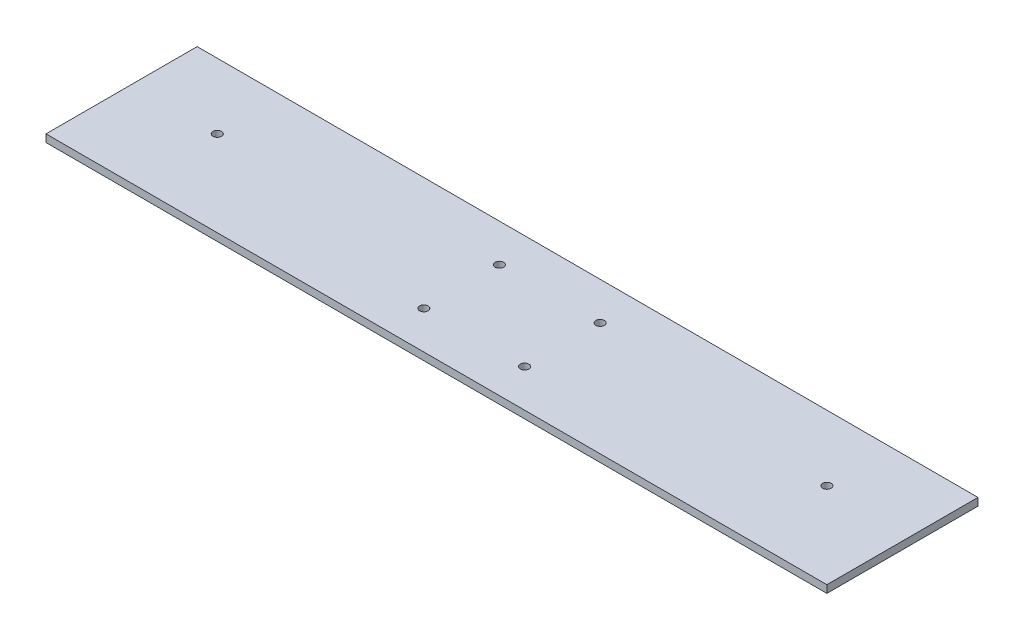
ISO-10303-21;
HEADER;
FILE_DESCRIPTION(('STEP AP214'),'2;1');
FILE_NAME('part.step','',(''),(''),'','','');
FILE_SCHEMA(('AUTOMOTIVE_DESIGN { 1 0 10303 214 1 1 1 1 }'));
ENDSEC;
DATA;
#1=APPLICATION_CONTEXT('core data for automotive mechanical design processes');
#2=APPLICATION_PROTOCOL_DEFINITION('international standard','automotive_design',2000,#1);
#3=PRODUCT_CONTEXT('',#1,'mechanical');
#4=PRODUCT('Part','Part','',(#3));
#5=PRODUCT_RELATED_PRODUCT_CATEGORY('part','',(#4));
#6=PRODUCT_DEFINITION_FORMATION('','',#4);
#7=PRODUCT_DEFINITION_CONTEXT('part definition',#1,'design');
#8=PRODUCT_DEFINITION('design','',#6,#7);
#9=PRODUCT_DEFINITION_SHAPE('','',#8);
#10=(LENGTH_UNIT() NAMED_UNIT(*) SI_UNIT(.MILLI.,.METRE.));
#11=(NAMED_UNIT(*) PLANE_ANGLE_UNIT() SI_UNIT($,.RADIAN.));
#12=(NAMED_UNIT(*) SI_UNIT($,.STERADIAN.) SOLID_ANGLE_UNIT());
#13=UNCERTAINTY_MEASURE_WITH_UNIT(LENGTH_MEASURE(1.E-05),#10,'distance_accuracy_value','');
#14=(GEOMETRIC_REPRESENTATION_CONTEXT(3) GLOBAL_UNCERTAINTY_ASSIGNED_CONTEXT((#13)) GLOBAL_UNIT_ASSIGNED_CONTEXT((#10,
#11,#12)) REPRESENTATION_CONTEXT('',''));
#15=CARTESIAN_POINT('',(0.,0.,0.));
#16=DIRECTION('',(0.,0.,1.));
#17=DIRECTION('',(1.,0.,0.));
#18=AXIS2_PLACEMENT_3D('',#15,#16,#17);
#19=CARTESIAN_POINT('',(0.,0.,0.));
#20=DIRECTION('',(0.,-1.,0.));
#21=DIRECTION('',(0.,0.,-1.));
#22=AXIS2_PLACEMENT_3D('',#19,#20,#21);
#23=PLANE('',#22);
#24=CARTESIAN_POINT('',(266.,0.,-34.));
#25=DIRECTION('',(0.,1.,0.));
#26=DIRECTION('',(0.,0.,1.));
#27=AXIS2_PLACEMENT_3D('',#24,#25,#26);
#28=CIRCLE('',#27,1.69999999999998);
#29=CARTESIAN_POINT('',(266.,0.,-32.3));
#30=VERTEX_POINT('',#29);
#31=EDGE_CURVE('E168',#30,#30,#28,.T.);
#32=ORIENTED_EDGE('',*,*,#31,.T.);
#33=EDGE_LOOP('',(#32));
#34=FACE_BOUND('',#33,.T.);
#35=DIRECTION('',(0.,0.,1.));
#36=VECTOR('',#35,1.);
#37=CARTESIAN_POINT('',(-10.,0.,0.));
#38=LINE('',#37,#36);
#39=CARTESIAN_POINT('',(-10.,0.,-60.));
#40=VERTEX_POINT('',#39);
#41=CARTESIAN_POINT('',(-10.,0.,0.));
#42=VERTEX_POINT('',#41);
#43=EDGE_CURVE('E108',#40,#42,#38,.T.);
#44=ORIENTED_EDGE('',*,*,#43,.F.);
#45=DIRECTION('',(-1.,0.,0.));
#46=VECTOR('',#45,1.);
#47=CARTESIAN_POINT('',(-10.,0.,-60.));
#48=LINE('',#47,#46);
#49=CARTESIAN_POINT('',(300.,0.,-60.));
#50=VERTEX_POINT('',#49);
#51=EDGE_CURVE('E80',#50,#40,#48,.T.);
#52=ORIENTED_EDGE('',*,*,#51,.F.);
#53=DIRECTION('',(0.,0.,-1.));
#54=VECTOR('',#53,1.);
#55=CARTESIAN_POINT('',(300.,0.,0.));
#56=LINE('',#55,#54);
#57=CARTESIAN_POINT('',(300.,0.,0.));
#58=VERTEX_POINT('',#57);
#59=EDGE_CURVE('E74',#58,#50,#56,.T.);
#60=ORIENTED_EDGE('',*,*,#59,.F.);
#61=DIRECTION('',(1.,0.,0.));
#62=VECTOR('',#61,1.);
#63=CARTESIAN_POINT('',(-10.,0.,0.));
#64=LINE('',#63,#62);
#65=EDGE_CURVE('E97',#42,#58,#64,.T.);
#66=ORIENTED_EDGE('',*,*,#65,.F.);
#67=EDGE_LOOP('',(#44,#52,#60,#66));
#68=FACE_BOUND('',#67,.T.);
#69=CARTESIAN_POINT('',(125.,0.,-45.));
#70=DIRECTION('',(0.,1.,0.));
#71=DIRECTION('',(0.,0.,1.));
#72=AXIS2_PLACEMENT_3D('',#69,#70,#71);
#73=CIRCLE('',#72,1.70000000000001);
#74=CARTESIAN_POINT('',(125.,0.,-43.3));
#75=VERTEX_POINT('',#74);
#76=EDGE_CURVE('E112',#75,#75,#73,.T.);
#77=ORIENTED_EDGE('',*,*,#76,.T.);
#78=EDGE_LOOP('',(#77));
#79=FACE_BOUND('',#78,.T.);
#80=CARTESIAN_POINT('',(165.,0.,-45.));
#81=DIRECTION('',(0.,1.,0.));
#82=DIRECTION('',(0.,0.,1.));
#83=AXIS2_PLACEMENT_3D('',#80,#81,#82);
#84=CIRCLE('',#83,1.70000000000001);
#85=CARTESIAN_POINT('',(165.,0.,-43.3));
#86=VERTEX_POINT('',#85);
#87=EDGE_CURVE('E136',#86,#86,#84,.T.);
#88=ORIENTED_EDGE('',*,*,#87,.T.);
#89=EDGE_LOOP('',(#88));
#90=FACE_BOUND('',#89,.T.);
#91=CARTESIAN_POINT('',(165.,0.,-15.));
#92=DIRECTION('',(0.,1.,0.));
#93=DIRECTION('',(0.,0.,1.));
#94=AXIS2_PLACEMENT_3D('',#91,#92,#93);
#95=CIRCLE('',#94,1.70000000000001);
#96=CARTESIAN_POINT('',(165.,0.,-13.3));
#97=VERTEX_POINT('',#96);
#98=EDGE_CURVE('E144',#97,#97,#95,.T.);
#99=ORIENTED_EDGE('',*,*,#98,.T.);
#100=EDGE_LOOP('',(#99));
#101=FACE_BOUND('',#100,.T.);
#102=CARTESIAN_POINT('',(125.,0.,-15.));
#103=DIRECTION('',(0.,1.,0.));
#104=DIRECTION('',(0.,0.,1.));
#105=AXIS2_PLACEMENT_3D('',#102,#103,#104);
#106=CIRCLE('',#105,1.70000000000001);
#107=CARTESIAN_POINT('',(125.,0.,-13.3));
#108=VERTEX_POINT('',#107);
#109=EDGE_CURVE('E152',#108,#108,#106,.T.);
#110=ORIENTED_EDGE('',*,*,#109,.T.);
#111=EDGE_LOOP('',(#110));
#112=FACE_BOUND('',#111,.T.);
#113=CARTESIAN_POINT('',(24.,0.,-34.));
#114=DIRECTION('',(0.,1.,0.));
#115=DIRECTION('',(0.,0.,1.));
#116=AXIS2_PLACEMENT_3D('',#113,#114,#115);
#117=CIRCLE('',#116,1.7);
#118=CARTESIAN_POINT('',(24.,0.,-32.3));
#119=VERTEX_POINT('',#118);
#120=EDGE_CURVE('E160',#119,#119,#117,.T.);
#121=ORIENTED_EDGE('',*,*,#120,.T.);
#122=EDGE_LOOP('',(#121));
#123=FACE_BOUND('',#122,.T.);
#124=ADVANCED_FACE('F39',(#34,#68,#79,#90,#101,#112,#123),#23,.T.);
#125=CARTESIAN_POINT('',(-10.,3.,0.));
#126=DIRECTION('',(1.,0.,0.));
#127=DIRECTION('',(0.,0.,-1.));
#128=AXIS2_PLACEMENT_3D('',#125,#126,#127);
#129=PLANE('',#128);
#130=ORIENTED_EDGE('',*,*,#43,.T.);
#131=DIRECTION('',(0.,-1.,0.));
#132=VECTOR('',#131,1.);
#133=CARTESIAN_POINT('',(-10.,3.,0.));
#134=LINE('',#133,#132);
#135=CARTESIAN_POINT('',(-10.,3.,0.));
#136=VERTEX_POINT('',#135);
#137=EDGE_CURVE('E11',#136,#42,#134,.T.);
#138=ORIENTED_EDGE('',*,*,#137,.F.);
#139=DIRECTION('',(0.,0.,1.));
#140=VECTOR('',#139,1.);
#141=CARTESIAN_POINT('',(-10.,3.,0.));
#142=LINE('',#141,#140);
#143=CARTESIAN_POINT('',(-10.,3.,-60.));
#144=VERTEX_POINT('',#143);
#145=EDGE_CURVE('E92',#144,#136,#142,.T.);
#146=ORIENTED_EDGE('',*,*,#145,.F.);
#147=DIRECTION('',(0.,-1.,0.));
#148=VECTOR('',#147,1.);
#149=CARTESIAN_POINT('',(-10.,3.,-60.));
#150=LINE('',#149,#148);
#151=EDGE_CURVE('E104',#144,#40,#150,.T.);
#152=ORIENTED_EDGE('',*,*,#151,.T.);
#153=EDGE_LOOP('',(#130,#138,#146,#152));
#154=FACE_BOUND('',#153,.T.);
#155=ADVANCED_FACE('F41',(#154),#129,.F.);
#156=CARTESIAN_POINT('',(-10.,3.,0.));
#157=DIRECTION('',(0.,0.,-1.));
#158=DIRECTION('',(-1.,0.,0.));
#159=AXIS2_PLACEMENT_3D('',#156,#157,#158);
#160=PLANE('',#159);
#161=ORIENTED_EDGE('',*,*,#65,.T.);
#162=DIRECTION('',(0.,-1.,0.));
#163=VECTOR('',#162,1.);
#164=CARTESIAN_POINT('',(300.,3.,0.));
#165=LINE('',#164,#163);
#166=CARTESIAN_POINT('',(300.,3.,0.));
#167=VERTEX_POINT('',#166);
#168=EDGE_CURVE('E49',#167,#58,#165,.T.);
#169=ORIENTED_EDGE('',*,*,#168,.F.);
#170=DIRECTION('',(1.,0.,0.));
#171=VECTOR('',#170,1.);
#172=CARTESIAN_POINT('',(-10.,3.,0.));
#173=LINE('',#172,#171);
#174=EDGE_CURVE('E87',#136,#167,#173,.T.);
#175=ORIENTED_EDGE('',*,*,#174,.F.);
#176=ORIENTED_EDGE('',*,*,#137,.T.);
#177=EDGE_LOOP('',(#161,#169,#175,#176));
#178=FACE_BOUND('',#177,.T.);
#179=ADVANCED_FACE('F96',(#178),#160,.F.);
#180=CARTESIAN_POINT('',(300.,3.,0.));
#181=DIRECTION('',(-1.,0.,0.));
#182=DIRECTION('',(0.,0.,1.));
#183=AXIS2_PLACEMENT_3D('',#180,#181,#182);
#184=PLANE('',#183);
#185=ORIENTED_EDGE('',*,*,#59,.T.);
#186=DIRECTION('',(0.,-1.,0.));
#187=VECTOR('',#186,1.);
#188=CARTESIAN_POINT('',(300.,3.,-60.));
#189=LINE('',#188,#187);
#190=CARTESIAN_POINT('',(300.,3.,-60.));
#191=VERTEX_POINT('',#190);
#192=EDGE_CURVE('E99',#191,#50,#189,.T.);
#193=ORIENTED_EDGE('',*,*,#192,.F.);
#194=DIRECTION('',(0.,0.,-1.));
#195=VECTOR('',#194,1.);
#196=CARTESIAN_POINT('',(300.,3.,0.));
#197=LINE('',#196,#195);
#198=EDGE_CURVE('E90',#167,#191,#197,.T.);
#199=ORIENTED_EDGE('',*,*,#198,.F.);
#200=ORIENTED_EDGE('',*,*,#168,.T.);
#201=EDGE_LOOP('',(#185,#193,#199,#200));
#202=FACE_BOUND('',#201,.T.);
#203=ADVANCED_FACE('F100',(#202),#184,.F.);
#204=CARTESIAN_POINT('',(-10.,3.,-60.));
#205=DIRECTION('',(0.,0.,1.));
#206=DIRECTION('',(1.,0.,0.));
#207=AXIS2_PLACEMENT_3D('',#204,#205,#206);
#208=PLANE('',#207);
#209=ORIENTED_EDGE('',*,*,#51,.T.);
#210=ORIENTED_EDGE('',*,*,#151,.F.);
#211=DIRECTION('',(-1.,0.,0.));
#212=VECTOR('',#211,1.);
#213=CARTESIAN_POINT('',(-10.,3.,-60.));
#214=LINE('',#213,#212);
#215=EDGE_CURVE('E57',#191,#144,#214,.T.);
#216=ORIENTED_EDGE('',*,*,#215,.F.);
#217=ORIENTED_EDGE('',*,*,#192,.T.);
#218=EDGE_LOOP('',(#209,#210,#216,#217));
#219=FACE_BOUND('',#218,.T.);
#220=ADVANCED_FACE('F122',(#219),#208,.F.);
#221=CARTESIAN_POINT('',(0.,3.,0.));
#222=DIRECTION('',(0.,-1.,0.));
#223=DIRECTION('',(0.,0.,-1.));
#224=AXIS2_PLACEMENT_3D('',#221,#222,#223);
#225=PLANE('',#224);
#226=CARTESIAN_POINT('',(266.,3.,-34.));
#227=DIRECTION('',(0.,1.,0.));
#228=DIRECTION('',(0.,0.,1.));
#229=AXIS2_PLACEMENT_3D('',#226,#227,#228);
#230=CIRCLE('',#229,1.69999999999998);
#231=CARTESIAN_POINT('',(266.,3.,-32.3));
#232=VERTEX_POINT('',#231);
#233=EDGE_CURVE('E172',#232,#232,#230,.T.);
#234=ORIENTED_EDGE('',*,*,#233,.F.);
#235=EDGE_LOOP('',(#234));
#236=FACE_BOUND('',#235,.T.);
#237=CARTESIAN_POINT('',(24.,3.,-34.));
#238=DIRECTION('',(0.,1.,0.));
#239=DIRECTION('',(0.,0.,1.));
#240=AXIS2_PLACEMENT_3D('',#237,#238,#239);
#241=CIRCLE('',#240,1.69999999999999);
#242=CARTESIAN_POINT('',(24.,3.,-32.3));
#243=VERTEX_POINT('',#242);
#244=EDGE_CURVE('E164',#243,#243,#241,.T.);
#245=ORIENTED_EDGE('',*,*,#244,.F.);
#246=EDGE_LOOP('',(#245));
#247=FACE_BOUND('',#246,.T.);
#248=CARTESIAN_POINT('',(125.,3.,-15.));
#249=DIRECTION('',(0.,1.,0.));
#250=DIRECTION('',(0.,0.,1.));
#251=AXIS2_PLACEMENT_3D('',#248,#249,#250);
#252=CIRCLE('',#251,1.69999999999998);
#253=CARTESIAN_POINT('',(125.,3.,-13.3));
#254=VERTEX_POINT('',#253);
#255=EDGE_CURVE('E156',#254,#254,#252,.T.);
#256=ORIENTED_EDGE('',*,*,#255,.F.);
#257=EDGE_LOOP('',(#256));
#258=FACE_BOUND('',#257,.T.);
#259=CARTESIAN_POINT('',(165.,3.,-15.));
#260=DIRECTION('',(0.,1.,0.));
#261=DIRECTION('',(0.,0.,1.));
#262=AXIS2_PLACEMENT_3D('',#259,#260,#261);
#263=CIRCLE('',#262,1.69999999999998);
#264=CARTESIAN_POINT('',(165.,3.,-13.3));
#265=VERTEX_POINT('',#264);
#266=EDGE_CURVE('E148',#265,#265,#263,.T.);
#267=ORIENTED_EDGE('',*,*,#266,.F.);
#268=EDGE_LOOP('',(#267));
#269=FACE_BOUND('',#268,.T.);
#270=CARTESIAN_POINT('',(165.,3.,-45.));
#271=DIRECTION('',(0.,1.,0.));
#272=DIRECTION('',(0.,0.,1.));
#273=AXIS2_PLACEMENT_3D('',#270,#271,#272);
#274=CIRCLE('',#273,1.69999999999998);
#275=CARTESIAN_POINT('',(165.,3.,-43.3));
#276=VERTEX_POINT('',#275);
#277=EDGE_CURVE('E140',#276,#276,#274,.T.);
#278=ORIENTED_EDGE('',*,*,#277,.F.);
#279=EDGE_LOOP('',(#278));
#280=FACE_BOUND('',#279,.T.);
#281=CARTESIAN_POINT('',(125.,3.,-45.));
#282=DIRECTION('',(0.,1.,0.));
#283=DIRECTION('',(0.,0.,1.));
#284=AXIS2_PLACEMENT_3D('',#281,#282,#283);
#285=CIRCLE('',#284,1.69999999999998);
#286=CARTESIAN_POINT('',(125.,3.,-43.3));
#287=VERTEX_POINT('',#286);
#288=EDGE_CURVE('E132',#287,#287,#285,.T.);
#289=ORIENTED_EDGE('',*,*,#288,.F.);
#290=EDGE_LOOP('',(#289));
#291=FACE_BOUND('',#290,.T.);
#292=ORIENTED_EDGE('',*,*,#145,.T.);
#293=ORIENTED_EDGE('',*,*,#174,.T.);
#294=ORIENTED_EDGE('',*,*,#198,.T.);
#295=ORIENTED_EDGE('',*,*,#215,.T.);
#296=EDGE_LOOP('',(#292,#293,#294,#295));
#297=FACE_BOUND('',#296,.T.);
#298=ADVANCED_FACE('F88',(#236,#247,#258,#269,#280,#291,#297),#225,.F.);
#299=CARTESIAN_POINT('',(125.,3.,-45.));
#300=DIRECTION('',(0.,1.,0.));
#301=DIRECTION('',(0.,0.,1.));
#302=AXIS2_PLACEMENT_3D('',#299,#300,#301);
#303=CYLINDRICAL_SURFACE('',#302,1.69999999999999);
#304=ORIENTED_EDGE('',*,*,#76,.F.);
#305=EDGE_LOOP('',(#304));
#306=FACE_BOUND('',#305,.T.);
#307=ORIENTED_EDGE('',*,*,#288,.T.);
#308=EDGE_LOOP('',(#307));
#309=FACE_BOUND('',#308,.T.);
#310=ADVANCED_FACE('F181',(#306,#309),#303,.F.);
#311=CARTESIAN_POINT('',(165.,3.,-45.));
#312=DIRECTION('',(0.,1.,0.));
#313=DIRECTION('',(0.,0.,1.));
#314=AXIS2_PLACEMENT_3D('',#311,#312,#313);
#315=CYLINDRICAL_SURFACE('',#314,1.69999999999999);
#316=ORIENTED_EDGE('',*,*,#87,.F.);
#317=EDGE_LOOP('',(#316));
#318=FACE_BOUND('',#317,.T.);
#319=ORIENTED_EDGE('',*,*,#277,.T.);
#320=EDGE_LOOP('',(#319));
#321=FACE_BOUND('',#320,.T.);
#322=ADVANCED_FACE('F194',(#318,#321),#315,.F.);
#323=CARTESIAN_POINT('',(165.,3.,-15.));
#324=DIRECTION('',(0.,1.,0.));
#325=DIRECTION('',(0.,0.,1.));
#326=AXIS2_PLACEMENT_3D('',#323,#324,#325);
#327=CYLINDRICAL_SURFACE('',#326,1.69999999999999);
#328=ORIENTED_EDGE('',*,*,#98,.F.);
#329=EDGE_LOOP('',(#328));
#330=FACE_BOUND('',#329,.T.);
#331=ORIENTED_EDGE('',*,*,#266,.T.);
#332=EDGE_LOOP('',(#331));
#333=FACE_BOUND('',#332,.T.);
#334=ADVANCED_FACE('F200',(#330,#333),#327,.F.);
#335=CARTESIAN_POINT('',(125.,3.,-15.));
#336=DIRECTION('',(0.,1.,0.));
#337=DIRECTION('',(0.,0.,1.));
#338=AXIS2_PLACEMENT_3D('',#335,#336,#337);
#339=CYLINDRICAL_SURFACE('',#338,1.69999999999999);
#340=ORIENTED_EDGE('',*,*,#109,.F.);
#341=EDGE_LOOP('',(#340));
#342=FACE_BOUND('',#341,.T.);
#343=ORIENTED_EDGE('',*,*,#255,.T.);
#344=EDGE_LOOP('',(#343));
#345=FACE_BOUND('',#344,.T.);
#346=ADVANCED_FACE('F252',(#342,#345),#339,.F.);
#347=CARTESIAN_POINT('',(24.,3.,-34.));
#348=DIRECTION('',(0.,1.,0.));
#349=DIRECTION('',(0.,0.,1.));
#350=AXIS2_PLACEMENT_3D('',#347,#348,#349);
#351=CYLINDRICAL_SURFACE('',#350,1.69999999999999);
#352=ORIENTED_EDGE('',*,*,#120,.F.);
#353=EDGE_LOOP('',(#352));
#354=FACE_BOUND('',#353,.T.);
#355=ORIENTED_EDGE('',*,*,#244,.T.);
#356=EDGE_LOOP('',(#355));
#357=FACE_BOUND('',#356,.T.);
#358=ADVANCED_FACE('F262',(#354,#357),#351,.F.);
#359=CARTESIAN_POINT('',(266.,3.,-34.));
#360=DIRECTION('',(0.,1.,0.));
#361=DIRECTION('',(0.,0.,1.));
#362=AXIS2_PLACEMENT_3D('',#359,#360,#361);
#363=CYLINDRICAL_SURFACE('',#362,1.69999999999998);
#364=ORIENTED_EDGE('',*,*,#31,.F.);
#365=EDGE_LOOP('',(#364));
#366=FACE_BOUND('',#365,.T.);
#367=ORIENTED_EDGE('',*,*,#233,.T.);
#368=EDGE_LOOP('',(#367));
#369=FACE_BOUND('',#368,.T.);
#370=ADVANCED_FACE('F177',(#366,#369),#363,.F.);
#371=CLOSED_SHELL('',(#124,#155,#179,#203,#220,#298,#310,#322,#334,#346,#358,#370));
#372=MANIFOLD_SOLID_BREP('B2',#371);
#373=ADVANCED_BREP_SHAPE_REPRESENTATION('',(#18,#372),#14);
#374=SHAPE_DEFINITION_REPRESENTATION(#9,#373);
ENDSEC;
END-ISO-10303-21;
